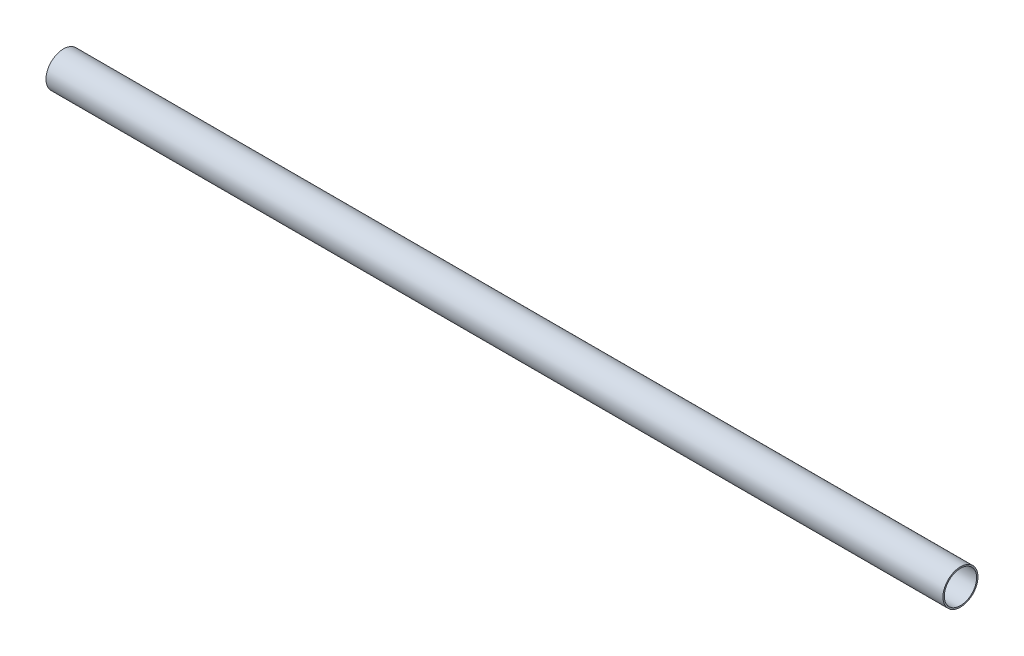
ISO-10303-21;
HEADER;
FILE_DESCRIPTION(('STEP AP214'),'2;1');
FILE_NAME('part.step','',(''),(''),'','','');
FILE_SCHEMA(('AUTOMOTIVE_DESIGN { 1 0 10303 214 1 1 1 1 }'));
ENDSEC;
DATA;
#1=APPLICATION_CONTEXT('core data for automotive mechanical design processes');
#2=APPLICATION_PROTOCOL_DEFINITION('international standard','automotive_design',2000,#1);
#3=PRODUCT_CONTEXT('',#1,'mechanical');
#4=PRODUCT('Part','Part','',(#3));
#5=PRODUCT_RELATED_PRODUCT_CATEGORY('part','',(#4));
#6=PRODUCT_DEFINITION_FORMATION('','',#4);
#7=PRODUCT_DEFINITION_CONTEXT('part definition',#1,'design');
#8=PRODUCT_DEFINITION('design','',#6,#7);
#9=PRODUCT_DEFINITION_SHAPE('','',#8);
#10=(LENGTH_UNIT() NAMED_UNIT(*) SI_UNIT(.MILLI.,.METRE.));
#11=(NAMED_UNIT(*) PLANE_ANGLE_UNIT() SI_UNIT($,.RADIAN.));
#12=(NAMED_UNIT(*) SI_UNIT($,.STERADIAN.) SOLID_ANGLE_UNIT());
#13=UNCERTAINTY_MEASURE_WITH_UNIT(LENGTH_MEASURE(1.E-05),#10,'distance_accuracy_value','');
#14=(GEOMETRIC_REPRESENTATION_CONTEXT(3) GLOBAL_UNCERTAINTY_ASSIGNED_CONTEXT((#13)) GLOBAL_UNIT_ASSIGNED_CONTEXT((#10,
#11,#12)) REPRESENTATION_CONTEXT('',''));
#15=CARTESIAN_POINT('',(0.,0.,0.));
#16=DIRECTION('',(0.,0.,1.));
#17=DIRECTION('',(1.,0.,0.));
#18=AXIS2_PLACEMENT_3D('',#15,#16,#17);
#19=CARTESIAN_POINT('',(650.,0.,0.));
#20=DIRECTION('',(1.,0.,0.));
#21=DIRECTION('',(0.,0.,-1.));
#22=AXIS2_PLACEMENT_3D('',#19,#20,#21);
#23=PLANE('',#22);
#24=CARTESIAN_POINT('',(650.,0.,0.));
#25=DIRECTION('',(1.,0.,0.));
#26=DIRECTION('',(0.,0.,-1.));
#27=AXIS2_PLACEMENT_3D('',#24,#25,#26);
#28=CIRCLE('',#27,25.4);
#29=CARTESIAN_POINT('',(650.,0.,-25.4));
#30=VERTEX_POINT('',#29);
#31=EDGE_CURVE('E10',#30,#30,#28,.T.);
#32=ORIENTED_EDGE('',*,*,#31,.T.);
#33=EDGE_LOOP('',(#32));
#34=FACE_BOUND('',#33,.T.);
#35=CARTESIAN_POINT('',(650.,0.,0.));
#36=DIRECTION('',(1.,0.,0.));
#37=DIRECTION('',(0.,0.,-1.));
#38=AXIS2_PLACEMENT_3D('',#35,#36,#37);
#39=CIRCLE('',#38,23.4);
#40=CARTESIAN_POINT('',(650.,0.,-23.4));
#41=VERTEX_POINT('',#40);
#42=EDGE_CURVE('E41',#41,#41,#39,.T.);
#43=ORIENTED_EDGE('',*,*,#42,.F.);
#44=EDGE_LOOP('',(#43));
#45=FACE_BOUND('',#44,.T.);
#46=ADVANCED_FACE('F30',(#34,#45),#23,.T.);
#47=CARTESIAN_POINT('',(-650.,0.,0.));
#48=DIRECTION('',(1.,0.,0.));
#49=DIRECTION('',(0.,0.,-1.));
#50=AXIS2_PLACEMENT_3D('',#47,#48,#49);
#51=PLANE('',#50);
#52=CARTESIAN_POINT('',(-650.,0.,0.));
#53=DIRECTION('',(1.,0.,0.));
#54=DIRECTION('',(0.,0.,-1.));
#55=AXIS2_PLACEMENT_3D('',#52,#53,#54);
#56=CIRCLE('',#55,25.4);
#57=CARTESIAN_POINT('',(-650.,0.,-25.4));
#58=VERTEX_POINT('',#57);
#59=EDGE_CURVE('E34',#58,#58,#56,.T.);
#60=ORIENTED_EDGE('',*,*,#59,.F.);
#61=EDGE_LOOP('',(#60));
#62=FACE_BOUND('',#61,.T.);
#63=CARTESIAN_POINT('',(-650.,0.,0.));
#64=DIRECTION('',(1.,0.,0.));
#65=DIRECTION('',(0.,0.,-1.));
#66=AXIS2_PLACEMENT_3D('',#63,#64,#65);
#67=CIRCLE('',#66,23.4);
#68=CARTESIAN_POINT('',(-650.,0.,-23.4));
#69=VERTEX_POINT('',#68);
#70=EDGE_CURVE('E43',#69,#69,#67,.T.);
#71=ORIENTED_EDGE('',*,*,#70,.T.);
#72=EDGE_LOOP('',(#71));
#73=FACE_BOUND('',#72,.T.);
#74=ADVANCED_FACE('F53',(#62,#73),#51,.F.);
#75=CARTESIAN_POINT('',(650.,0.,0.));
#76=DIRECTION('',(-1.,0.,0.));
#77=DIRECTION('',(0.,0.,1.));
#78=AXIS2_PLACEMENT_3D('',#75,#76,#77);
#79=CYLINDRICAL_SURFACE('',#78,25.4);
#80=ORIENTED_EDGE('',*,*,#31,.F.);
#81=EDGE_LOOP('',(#80));
#82=FACE_BOUND('',#81,.T.);
#83=ORIENTED_EDGE('',*,*,#59,.T.);
#84=EDGE_LOOP('',(#83));
#85=FACE_BOUND('',#84,.T.);
#86=ADVANCED_FACE('F32',(#82,#85),#79,.T.);
#87=CARTESIAN_POINT('',(650.,0.,0.));
#88=DIRECTION('',(-1.,0.,0.));
#89=DIRECTION('',(0.,0.,1.));
#90=AXIS2_PLACEMENT_3D('',#87,#88,#89);
#91=CYLINDRICAL_SURFACE('',#90,23.4);
#92=ORIENTED_EDGE('',*,*,#42,.T.);
#93=EDGE_LOOP('',(#92));
#94=FACE_BOUND('',#93,.T.);
#95=ORIENTED_EDGE('',*,*,#70,.F.);
#96=EDGE_LOOP('',(#95));
#97=FACE_BOUND('',#96,.T.);
#98=ADVANCED_FACE('F49',(#94,#97),#91,.F.);
#99=CLOSED_SHELL('',(#46,#74,#86,#98));
#100=MANIFOLD_SOLID_BREP('B2',#99);
#101=ADVANCED_BREP_SHAPE_REPRESENTATION('',(#18,#100),#14);
#102=SHAPE_DEFINITION_REPRESENTATION(#9,#101);
ENDSEC;
END-ISO-10303-21;
